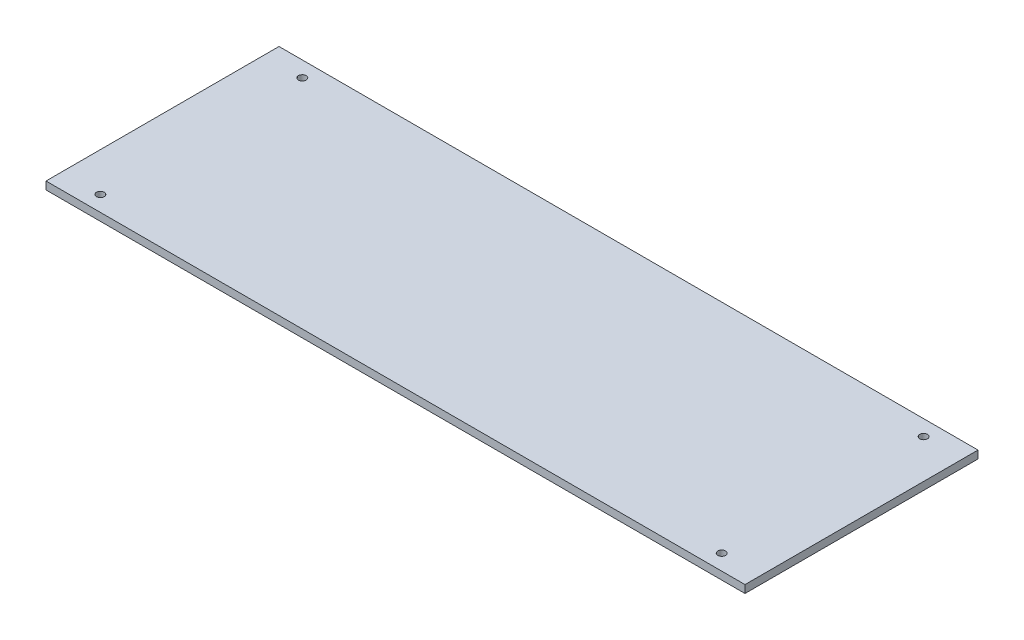
ISO-10303-21;
HEADER;
FILE_DESCRIPTION(('STEP AP214'),'2;1');
FILE_NAME('part.step','',(''),(''),'','','');
FILE_SCHEMA(('AUTOMOTIVE_DESIGN { 1 0 10303 214 1 1 1 1 }'));
ENDSEC;
DATA;
#1=APPLICATION_CONTEXT('core data for automotive mechanical design processes');
#2=APPLICATION_PROTOCOL_DEFINITION('international standard','automotive_design',2000,#1);
#3=PRODUCT_CONTEXT('',#1,'mechanical');
#4=PRODUCT('Part','Part','',(#3));
#5=PRODUCT_RELATED_PRODUCT_CATEGORY('part','',(#4));
#6=PRODUCT_DEFINITION_FORMATION('','',#4);
#7=PRODUCT_DEFINITION_CONTEXT('part definition',#1,'design');
#8=PRODUCT_DEFINITION('design','',#6,#7);
#9=PRODUCT_DEFINITION_SHAPE('','',#8);
#10=(LENGTH_UNIT() NAMED_UNIT(*) SI_UNIT(.MILLI.,.METRE.));
#11=(NAMED_UNIT(*) PLANE_ANGLE_UNIT() SI_UNIT($,.RADIAN.));
#12=(NAMED_UNIT(*) SI_UNIT($,.STERADIAN.) SOLID_ANGLE_UNIT());
#13=UNCERTAINTY_MEASURE_WITH_UNIT(LENGTH_MEASURE(1.E-05),#10,'distance_accuracy_value','');
#14=(GEOMETRIC_REPRESENTATION_CONTEXT(3) GLOBAL_UNCERTAINTY_ASSIGNED_CONTEXT((#13)) GLOBAL_UNIT_ASSIGNED_CONTEXT((#10,
#11,#12)) REPRESENTATION_CONTEXT('',''));
#15=CARTESIAN_POINT('',(0.,0.,0.));
#16=DIRECTION('',(0.,0.,1.));
#17=DIRECTION('',(1.,0.,0.));
#18=AXIS2_PLACEMENT_3D('',#15,#16,#17);
#19=CARTESIAN_POINT('',(225.,5.,-75.));
#20=DIRECTION('',(-1.,0.,0.));
#21=DIRECTION('',(0.,0.,1.));
#22=AXIS2_PLACEMENT_3D('',#19,#20,#21);
#23=PLANE('',#22);
#24=DIRECTION('',(0.,0.,-1.));
#25=VECTOR('',#24,1.);
#26=CARTESIAN_POINT('',(225.,0.,-75.));
#27=LINE('',#26,#25);
#28=CARTESIAN_POINT('',(225.,0.,75.));
#29=VERTEX_POINT('',#28);
#30=CARTESIAN_POINT('',(225.,0.,-75.));
#31=VERTEX_POINT('',#30);
#32=EDGE_CURVE('E107',#29,#31,#27,.T.);
#33=ORIENTED_EDGE('',*,*,#32,.T.);
#34=DIRECTION('',(0.,-1.,0.));
#35=VECTOR('',#34,1.);
#36=CARTESIAN_POINT('',(225.,5.,-75.));
#37=LINE('',#36,#35);
#38=CARTESIAN_POINT('',(225.,5.,-75.));
#39=VERTEX_POINT('',#38);
#40=EDGE_CURVE('E11',#39,#31,#37,.T.);
#41=ORIENTED_EDGE('',*,*,#40,.F.);
#42=DIRECTION('',(0.,0.,-1.));
#43=VECTOR('',#42,1.);
#44=CARTESIAN_POINT('',(225.,5.,-75.));
#45=LINE('',#44,#43);
#46=CARTESIAN_POINT('',(225.,5.,75.));
#47=VERTEX_POINT('',#46);
#48=EDGE_CURVE('E91',#47,#39,#45,.T.);
#49=ORIENTED_EDGE('',*,*,#48,.F.);
#50=DIRECTION('',(0.,-1.,0.));
#51=VECTOR('',#50,1.);
#52=CARTESIAN_POINT('',(225.,5.,75.));
#53=LINE('',#52,#51);
#54=EDGE_CURVE('E103',#47,#29,#53,.T.);
#55=ORIENTED_EDGE('',*,*,#54,.T.);
#56=EDGE_LOOP('',(#33,#41,#49,#55));
#57=FACE_BOUND('',#56,.T.);
#58=ADVANCED_FACE('F39',(#57),#23,.F.);
#59=CARTESIAN_POINT('',(-225.,5.,-75.));
#60=DIRECTION('',(0.,0.,1.));
#61=DIRECTION('',(1.,0.,0.));
#62=AXIS2_PLACEMENT_3D('',#59,#60,#61);
#63=PLANE('',#62);
#64=DIRECTION('',(-1.,0.,0.));
#65=VECTOR('',#64,1.);
#66=CARTESIAN_POINT('',(-225.,0.,-75.));
#67=LINE('',#66,#65);
#68=CARTESIAN_POINT('',(-225.,0.,-75.));
#69=VERTEX_POINT('',#68);
#70=EDGE_CURVE('E96',#31,#69,#67,.T.);
#71=ORIENTED_EDGE('',*,*,#70,.T.);
#72=DIRECTION('',(0.,-1.,0.));
#73=VECTOR('',#72,1.);
#74=CARTESIAN_POINT('',(-225.,5.,-75.));
#75=LINE('',#74,#73);
#76=CARTESIAN_POINT('',(-225.,5.,-75.));
#77=VERTEX_POINT('',#76);
#78=EDGE_CURVE('E48',#77,#69,#75,.T.);
#79=ORIENTED_EDGE('',*,*,#78,.F.);
#80=DIRECTION('',(-1.,0.,0.));
#81=VECTOR('',#80,1.);
#82=CARTESIAN_POINT('',(-225.,5.,-75.));
#83=LINE('',#82,#81);
#84=EDGE_CURVE('E86',#39,#77,#83,.T.);
#85=ORIENTED_EDGE('',*,*,#84,.F.);
#86=ORIENTED_EDGE('',*,*,#40,.T.);
#87=EDGE_LOOP('',(#71,#79,#85,#86));
#88=FACE_BOUND('',#87,.T.);
#89=ADVANCED_FACE('F95',(#88),#63,.F.);
#90=CARTESIAN_POINT('',(-225.,5.,-75.));
#91=DIRECTION('',(1.,0.,0.));
#92=DIRECTION('',(0.,0.,-1.));
#93=AXIS2_PLACEMENT_3D('',#90,#91,#92);
#94=PLANE('',#93);
#95=DIRECTION('',(0.,0.,1.));
#96=VECTOR('',#95,1.);
#97=CARTESIAN_POINT('',(-225.,0.,-75.));
#98=LINE('',#97,#96);
#99=CARTESIAN_POINT('',(-225.,0.,75.));
#100=VERTEX_POINT('',#99);
#101=EDGE_CURVE('E73',#69,#100,#98,.T.);
#102=ORIENTED_EDGE('',*,*,#101,.T.);
#103=DIRECTION('',(0.,-1.,0.));
#104=VECTOR('',#103,1.);
#105=CARTESIAN_POINT('',(-225.,5.,75.));
#106=LINE('',#105,#104);
#107=CARTESIAN_POINT('',(-225.,5.,75.));
#108=VERTEX_POINT('',#107);
#109=EDGE_CURVE('E98',#108,#100,#106,.T.);
#110=ORIENTED_EDGE('',*,*,#109,.F.);
#111=DIRECTION('',(0.,0.,1.));
#112=VECTOR('',#111,1.);
#113=CARTESIAN_POINT('',(-225.,5.,-75.));
#114=LINE('',#113,#112);
#115=EDGE_CURVE('E89',#77,#108,#114,.T.);
#116=ORIENTED_EDGE('',*,*,#115,.F.);
#117=ORIENTED_EDGE('',*,*,#78,.T.);
#118=EDGE_LOOP('',(#102,#110,#116,#117));
#119=FACE_BOUND('',#118,.T.);
#120=ADVANCED_FACE('F99',(#119),#94,.F.);
#121=CARTESIAN_POINT('',(-225.,5.,75.));
#122=DIRECTION('',(0.,0.,-1.));
#123=DIRECTION('',(-1.,0.,0.));
#124=AXIS2_PLACEMENT_3D('',#121,#122,#123);
#125=PLANE('',#124);
#126=DIRECTION('',(1.,0.,0.));
#127=VECTOR('',#126,1.);
#128=CARTESIAN_POINT('',(-225.,0.,75.));
#129=LINE('',#128,#127);
#130=EDGE_CURVE('E79',#100,#29,#129,.T.);
#131=ORIENTED_EDGE('',*,*,#130,.T.);
#132=ORIENTED_EDGE('',*,*,#54,.F.);
#133=DIRECTION('',(1.,0.,0.));
#134=VECTOR('',#133,1.);
#135=CARTESIAN_POINT('',(-225.,5.,75.));
#136=LINE('',#135,#134);
#137=EDGE_CURVE('E56',#108,#47,#136,.T.);
#138=ORIENTED_EDGE('',*,*,#137,.F.);
#139=ORIENTED_EDGE('',*,*,#109,.T.);
#140=EDGE_LOOP('',(#131,#132,#138,#139));
#141=FACE_BOUND('',#140,.T.);
#142=ADVANCED_FACE('F121',(#141),#125,.F.);
#143=CARTESIAN_POINT('',(0.,5.,0.));
#144=DIRECTION('',(0.,1.,0.));
#145=DIRECTION('',(0.,0.,1.));
#146=AXIS2_PLACEMENT_3D('',#143,#144,#145);
#147=PLANE('',#146);
#148=CARTESIAN_POINT('',(-200.,5.,65.));
#149=DIRECTION('',(0.,1.,0.));
#150=DIRECTION('',(0.,0.,1.));
#151=AXIS2_PLACEMENT_3D('',#148,#149,#150);
#152=CIRCLE('',#151,2.5);
#153=CARTESIAN_POINT('',(-200.,5.,67.5));
#154=VERTEX_POINT('',#153);
#155=EDGE_CURVE('E145',#154,#154,#152,.T.);
#156=ORIENTED_EDGE('',*,*,#155,.F.);
#157=EDGE_LOOP('',(#156));
#158=FACE_BOUND('',#157,.T.);
#159=CARTESIAN_POINT('',(200.,5.,-65.));
#160=DIRECTION('',(0.,1.,0.));
#161=DIRECTION('',(0.,0.,1.));
#162=AXIS2_PLACEMENT_3D('',#159,#160,#161);
#163=CIRCLE('',#162,2.5);
#164=CARTESIAN_POINT('',(200.,5.,-62.5));
#165=VERTEX_POINT('',#164);
#166=EDGE_CURVE('E136',#165,#165,#163,.T.);
#167=ORIENTED_EDGE('',*,*,#166,.F.);
#168=EDGE_LOOP('',(#167));
#169=FACE_BOUND('',#168,.T.);
#170=CARTESIAN_POINT('',(200.,5.,65.));
#171=DIRECTION('',(0.,1.,0.));
#172=DIRECTION('',(0.,0.,1.));
#173=AXIS2_PLACEMENT_3D('',#170,#171,#172);
#174=CIRCLE('',#173,2.5);
#175=CARTESIAN_POINT('',(200.,5.,67.5));
#176=VERTEX_POINT('',#175);
#177=EDGE_CURVE('E152',#176,#176,#174,.T.);
#178=ORIENTED_EDGE('',*,*,#177,.F.);
#179=EDGE_LOOP('',(#178));
#180=FACE_BOUND('',#179,.T.);
#181=CARTESIAN_POINT('',(-200.,5.,-65.));
#182=DIRECTION('',(0.,1.,0.));
#183=DIRECTION('',(0.,0.,1.));
#184=AXIS2_PLACEMENT_3D('',#181,#182,#183);
#185=CIRCLE('',#184,2.5);
#186=CARTESIAN_POINT('',(-200.,5.,-62.5));
#187=VERTEX_POINT('',#186);
#188=EDGE_CURVE('E128',#187,#187,#185,.T.);
#189=ORIENTED_EDGE('',*,*,#188,.F.);
#190=EDGE_LOOP('',(#189));
#191=FACE_BOUND('',#190,.T.);
#192=ORIENTED_EDGE('',*,*,#48,.T.);
#193=ORIENTED_EDGE('',*,*,#84,.T.);
#194=ORIENTED_EDGE('',*,*,#115,.T.);
#195=ORIENTED_EDGE('',*,*,#137,.T.);
#196=EDGE_LOOP('',(#192,#193,#194,#195));
#197=FACE_BOUND('',#196,.T.);
#198=ADVANCED_FACE('F87',(#158,#169,#180,#191,#197),#147,.T.);
#199=CARTESIAN_POINT('',(0.,0.,0.));
#200=DIRECTION('',(0.,1.,0.));
#201=DIRECTION('',(0.,0.,1.));
#202=AXIS2_PLACEMENT_3D('',#199,#200,#201);
#203=PLANE('',#202);
#204=CARTESIAN_POINT('',(-200.,0.,65.));
#205=DIRECTION('',(0.,1.,0.));
#206=DIRECTION('',(0.,0.,1.));
#207=AXIS2_PLACEMENT_3D('',#204,#205,#206);
#208=CIRCLE('',#207,2.5);
#209=CARTESIAN_POINT('',(-200.,0.,67.5));
#210=VERTEX_POINT('',#209);
#211=EDGE_CURVE('E132',#210,#210,#208,.T.);
#212=ORIENTED_EDGE('',*,*,#211,.T.);
#213=EDGE_LOOP('',(#212));
#214=FACE_BOUND('',#213,.T.);
#215=CARTESIAN_POINT('',(200.,0.,-65.));
#216=DIRECTION('',(0.,1.,0.));
#217=DIRECTION('',(0.,0.,1.));
#218=AXIS2_PLACEMENT_3D('',#215,#216,#217);
#219=CIRCLE('',#218,2.5);
#220=CARTESIAN_POINT('',(200.,0.,-62.5));
#221=VERTEX_POINT('',#220);
#222=EDGE_CURVE('E140',#221,#221,#219,.T.);
#223=ORIENTED_EDGE('',*,*,#222,.T.);
#224=EDGE_LOOP('',(#223));
#225=FACE_BOUND('',#224,.T.);
#226=CARTESIAN_POINT('',(200.,0.,65.));
#227=DIRECTION('',(0.,1.,0.));
#228=DIRECTION('',(0.,0.,1.));
#229=AXIS2_PLACEMENT_3D('',#226,#227,#228);
#230=CIRCLE('',#229,2.5);
#231=CARTESIAN_POINT('',(200.,0.,67.5));
#232=VERTEX_POINT('',#231);
#233=EDGE_CURVE('E141',#232,#232,#230,.T.);
#234=ORIENTED_EDGE('',*,*,#233,.T.);
#235=EDGE_LOOP('',(#234));
#236=FACE_BOUND('',#235,.T.);
#237=CARTESIAN_POINT('',(-200.,0.,-65.));
#238=DIRECTION('',(0.,1.,0.));
#239=DIRECTION('',(0.,0.,1.));
#240=AXIS2_PLACEMENT_3D('',#237,#238,#239);
#241=CIRCLE('',#240,2.5);
#242=CARTESIAN_POINT('',(-200.,0.,-62.5));
#243=VERTEX_POINT('',#242);
#244=EDGE_CURVE('E111',#243,#243,#241,.T.);
#245=ORIENTED_EDGE('',*,*,#244,.T.);
#246=EDGE_LOOP('',(#245));
#247=FACE_BOUND('',#246,.T.);
#248=ORIENTED_EDGE('',*,*,#32,.F.);
#249=ORIENTED_EDGE('',*,*,#130,.F.);
#250=ORIENTED_EDGE('',*,*,#101,.F.);
#251=ORIENTED_EDGE('',*,*,#70,.F.);
#252=EDGE_LOOP('',(#248,#249,#250,#251));
#253=FACE_BOUND('',#252,.T.);
#254=ADVANCED_FACE('F124',(#214,#225,#236,#247,#253),#203,.F.);
#255=CARTESIAN_POINT('',(-200.,0.,-65.));
#256=DIRECTION('',(0.,1.,0.));
#257=DIRECTION('',(0.,0.,1.));
#258=AXIS2_PLACEMENT_3D('',#255,#256,#257);
#259=CYLINDRICAL_SURFACE('',#258,2.5);
#260=ORIENTED_EDGE('',*,*,#244,.F.);
#261=EDGE_LOOP('',(#260));
#262=FACE_BOUND('',#261,.T.);
#263=ORIENTED_EDGE('',*,*,#188,.T.);
#264=EDGE_LOOP('',(#263));
#265=FACE_BOUND('',#264,.T.);
#266=ADVANCED_FACE('F166',(#262,#265),#259,.F.);
#267=CARTESIAN_POINT('',(200.,0.,65.));
#268=DIRECTION('',(0.,1.,0.));
#269=DIRECTION('',(0.,0.,1.));
#270=AXIS2_PLACEMENT_3D('',#267,#268,#269);
#271=CYLINDRICAL_SURFACE('',#270,2.5);
#272=ORIENTED_EDGE('',*,*,#233,.F.);
#273=EDGE_LOOP('',(#272));
#274=FACE_BOUND('',#273,.T.);
#275=ORIENTED_EDGE('',*,*,#177,.T.);
#276=EDGE_LOOP('',(#275));
#277=FACE_BOUND('',#276,.T.);
#278=ADVANCED_FACE('F162',(#274,#277),#271,.F.);
#279=CARTESIAN_POINT('',(200.,0.,-65.));
#280=DIRECTION('',(0.,1.,0.));
#281=DIRECTION('',(0.,0.,1.));
#282=AXIS2_PLACEMENT_3D('',#279,#280,#281);
#283=CYLINDRICAL_SURFACE('',#282,2.5);
#284=ORIENTED_EDGE('',*,*,#222,.F.);
#285=EDGE_LOOP('',(#284));
#286=FACE_BOUND('',#285,.T.);
#287=ORIENTED_EDGE('',*,*,#166,.T.);
#288=EDGE_LOOP('',(#287));
#289=FACE_BOUND('',#288,.T.);
#290=ADVANCED_FACE('F165',(#286,#289),#283,.F.);
#291=CARTESIAN_POINT('',(-200.,0.,65.));
#292=DIRECTION('',(0.,1.,0.));
#293=DIRECTION('',(0.,0.,1.));
#294=AXIS2_PLACEMENT_3D('',#291,#292,#293);
#295=CYLINDRICAL_SURFACE('',#294,2.5);
#296=ORIENTED_EDGE('',*,*,#211,.F.);
#297=EDGE_LOOP('',(#296));
#298=FACE_BOUND('',#297,.T.);
#299=ORIENTED_EDGE('',*,*,#155,.T.);
#300=EDGE_LOOP('',(#299));
#301=FACE_BOUND('',#300,.T.);
#302=ADVANCED_FACE('F227',(#298,#301),#295,.F.);
#303=CLOSED_SHELL('',(#58,#89,#120,#142,#198,#254,#266,#278,#290,#302));
#304=MANIFOLD_SOLID_BREP('B2',#303);
#305=ADVANCED_BREP_SHAPE_REPRESENTATION('',(#18,#304),#14);
#306=SHAPE_DEFINITION_REPRESENTATION(#9,#305);
ENDSEC;
END-ISO-10303-21;
